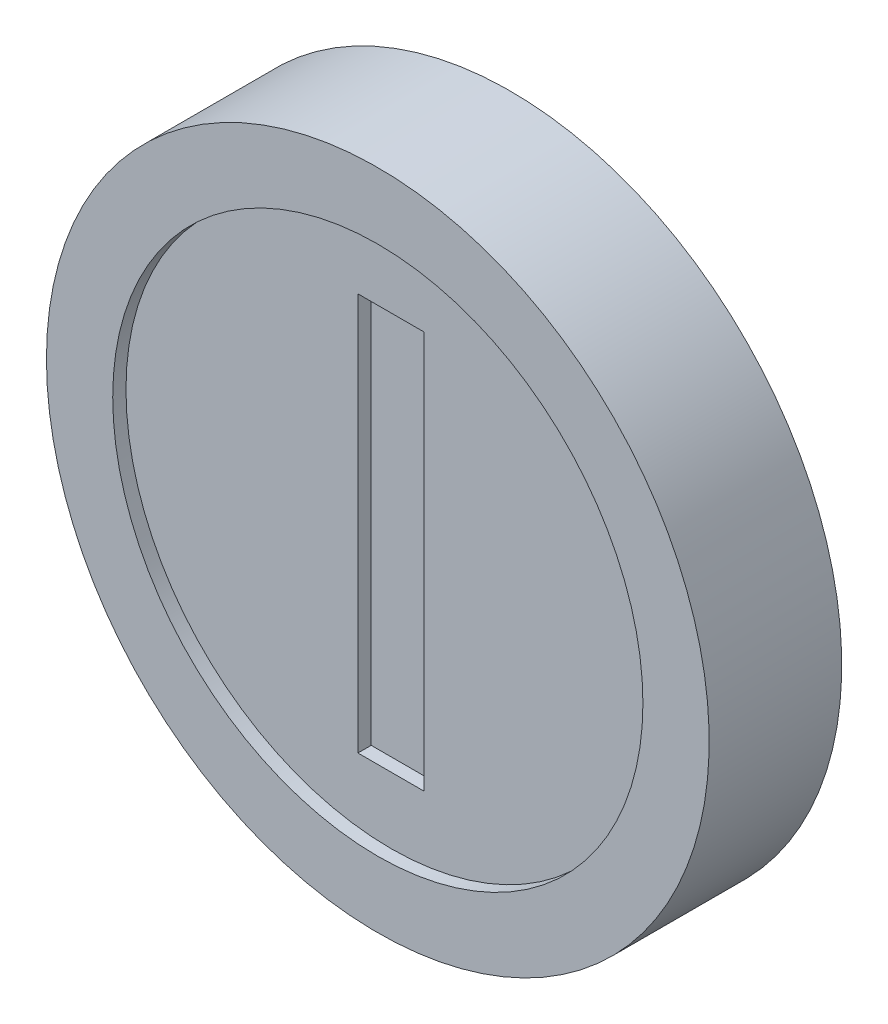
ISO-10303-21;
HEADER;
FILE_DESCRIPTION(('STEP AP214'),'2;1');
FILE_NAME('part.step','',(''),(''),'','','');
FILE_SCHEMA(('AUTOMOTIVE_DESIGN { 1 0 10303 214 1 1 1 1 }'));
ENDSEC;
DATA;
#1=APPLICATION_CONTEXT('core data for automotive mechanical design processes');
#2=APPLICATION_PROTOCOL_DEFINITION('international standard','automotive_design',2000,#1);
#3=PRODUCT_CONTEXT('',#1,'mechanical');
#4=PRODUCT('Part','Part','',(#3));
#5=PRODUCT_RELATED_PRODUCT_CATEGORY('part','',(#4));
#6=PRODUCT_DEFINITION_FORMATION('','',#4);
#7=PRODUCT_DEFINITION_CONTEXT('part definition',#1,'design');
#8=PRODUCT_DEFINITION('design','',#6,#7);
#9=PRODUCT_DEFINITION_SHAPE('','',#8);
#10=(LENGTH_UNIT() NAMED_UNIT(*) SI_UNIT(.MILLI.,.METRE.));
#11=(NAMED_UNIT(*) PLANE_ANGLE_UNIT() SI_UNIT($,.RADIAN.));
#12=(NAMED_UNIT(*) SI_UNIT($,.STERADIAN.) SOLID_ANGLE_UNIT());
#13=UNCERTAINTY_MEASURE_WITH_UNIT(LENGTH_MEASURE(1.E-05),#10,'distance_accuracy_value','');
#14=(GEOMETRIC_REPRESENTATION_CONTEXT(3) GLOBAL_UNCERTAINTY_ASSIGNED_CONTEXT((#13)) GLOBAL_UNIT_ASSIGNED_CONTEXT((#10,
#11,#12)) REPRESENTATION_CONTEXT('',''));
#15=CARTESIAN_POINT('',(0.,0.,0.));
#16=DIRECTION('',(0.,0.,1.));
#17=DIRECTION('',(1.,0.,0.));
#18=AXIS2_PLACEMENT_3D('',#15,#16,#17);
#19=CARTESIAN_POINT('',(0.,0.,-5.08));
#20=DIRECTION('',(0.,0.,1.));
#21=DIRECTION('',(1.,0.,0.));
#22=AXIS2_PLACEMENT_3D('',#19,#20,#21);
#23=PLANE('',#22);
#24=CARTESIAN_POINT('',(0.,0.,-5.08));
#25=DIRECTION('',(0.,0.,-1.));
#26=DIRECTION('',(-1.,0.,0.));
#27=AXIS2_PLACEMENT_3D('',#24,#25,#26);
#28=CIRCLE('',#27,25.4);
#29=CARTESIAN_POINT('',(-25.4,0.,-5.08));
#30=VERTEX_POINT('',#29);
#31=EDGE_CURVE('E175',#30,#30,#28,.T.);
#32=ORIENTED_EDGE('',*,*,#31,.T.);
#33=EDGE_LOOP('',(#32));
#34=FACE_BOUND('',#33,.T.);
#35=DIRECTION('',(0.,1.,0.));
#36=VECTOR('',#35,1.);
#37=CARTESIAN_POINT('',(3.175,-19.05,-5.08));
#38=LINE('',#37,#36);
#39=CARTESIAN_POINT('',(3.175,-19.05,-5.08));
#40=VERTEX_POINT('',#39);
#41=CARTESIAN_POINT('',(3.175,19.05,-5.08));
#42=VERTEX_POINT('',#41);
#43=EDGE_CURVE('E62',#40,#42,#38,.T.);
#44=ORIENTED_EDGE('',*,*,#43,.T.);
#45=DIRECTION('',(-1.,0.,0.));
#46=VECTOR('',#45,1.);
#47=CARTESIAN_POINT('',(-3.175,19.05,-5.08));
#48=LINE('',#47,#46);
#49=CARTESIAN_POINT('',(-3.175,19.05,-5.08));
#50=VERTEX_POINT('',#49);
#51=EDGE_CURVE('E132',#42,#50,#48,.T.);
#52=ORIENTED_EDGE('',*,*,#51,.T.);
#53=DIRECTION('',(0.,-1.,0.));
#54=VECTOR('',#53,1.);
#55=CARTESIAN_POINT('',(-3.175,-19.05,-5.08));
#56=LINE('',#55,#54);
#57=CARTESIAN_POINT('',(-3.175,-19.05,-5.08));
#58=VERTEX_POINT('',#57);
#59=EDGE_CURVE('E135',#50,#58,#56,.T.);
#60=ORIENTED_EDGE('',*,*,#59,.T.);
#61=DIRECTION('',(1.,0.,0.));
#62=VECTOR('',#61,1.);
#63=CARTESIAN_POINT('',(-3.175,-19.05,-5.08));
#64=LINE('',#63,#62);
#65=EDGE_CURVE('E141',#58,#40,#64,.T.);
#66=ORIENTED_EDGE('',*,*,#65,.T.);
#67=EDGE_LOOP('',(#44,#52,#60,#66));
#68=FACE_BOUND('',#67,.T.);
#69=ADVANCED_FACE('F47',(#34,#68),#23,.F.);
#70=CARTESIAN_POINT('',(0.,0.,5.08));
#71=DIRECTION('',(0.,0.,1.));
#72=DIRECTION('',(1.,0.,0.));
#73=AXIS2_PLACEMENT_3D('',#70,#71,#72);
#74=PLANE('',#73);
#75=DIRECTION('',(0.,1.,0.));
#76=VECTOR('',#75,1.);
#77=CARTESIAN_POINT('',(3.175,-19.05,5.08));
#78=LINE('',#77,#76);
#79=CARTESIAN_POINT('',(3.175,-19.05,5.08));
#80=VERTEX_POINT('',#79);
#81=CARTESIAN_POINT('',(3.175,19.05,5.08));
#82=VERTEX_POINT('',#81);
#83=EDGE_CURVE('E70',#80,#82,#78,.T.);
#84=ORIENTED_EDGE('',*,*,#83,.F.);
#85=DIRECTION('',(1.,0.,0.));
#86=VECTOR('',#85,1.);
#87=CARTESIAN_POINT('',(-3.175,-19.05,5.08));
#88=LINE('',#87,#86);
#89=CARTESIAN_POINT('',(-3.175,-19.05,5.08));
#90=VERTEX_POINT('',#89);
#91=EDGE_CURVE('E154',#90,#80,#88,.T.);
#92=ORIENTED_EDGE('',*,*,#91,.F.);
#93=DIRECTION('',(0.,-1.,0.));
#94=VECTOR('',#93,1.);
#95=CARTESIAN_POINT('',(-3.175,-19.05,5.08));
#96=LINE('',#95,#94);
#97=CARTESIAN_POINT('',(-3.175,19.05,5.08));
#98=VERTEX_POINT('',#97);
#99=EDGE_CURVE('E168',#98,#90,#96,.T.);
#100=ORIENTED_EDGE('',*,*,#99,.F.);
#101=DIRECTION('',(-1.,0.,0.));
#102=VECTOR('',#101,1.);
#103=CARTESIAN_POINT('',(-3.175,19.05,5.08));
#104=LINE('',#103,#102);
#105=EDGE_CURVE('E165',#82,#98,#104,.T.);
#106=ORIENTED_EDGE('',*,*,#105,.F.);
#107=EDGE_LOOP('',(#84,#92,#100,#106));
#108=FACE_BOUND('',#107,.T.);
#109=CARTESIAN_POINT('',(0.,0.,5.08));
#110=DIRECTION('',(0.,0.,-1.));
#111=DIRECTION('',(-1.,0.,0.));
#112=AXIS2_PLACEMENT_3D('',#109,#110,#111);
#113=CIRCLE('',#112,25.4);
#114=CARTESIAN_POINT('',(-25.4,0.,5.08));
#115=VERTEX_POINT('',#114);
#116=EDGE_CURVE('E11',#115,#115,#113,.T.);
#117=ORIENTED_EDGE('',*,*,#116,.F.);
#118=EDGE_LOOP('',(#117));
#119=FACE_BOUND('',#118,.T.);
#120=ADVANCED_FACE('F49',(#108,#119),#74,.T.);
#121=CARTESIAN_POINT('',(0.,0.,-88.99));
#122=DIRECTION('',(0.,0.,-1.));
#123=DIRECTION('',(-1.,0.,0.));
#124=AXIS2_PLACEMENT_3D('',#121,#122,#123);
#125=CYLINDRICAL_SURFACE('',#124,25.4);
#126=ORIENTED_EDGE('',*,*,#116,.T.);
#127=EDGE_LOOP('',(#126));
#128=FACE_BOUND('',#127,.T.);
#129=CARTESIAN_POINT('',(0.,0.,6.34999999999998));
#130=DIRECTION('',(0.,0.,-1.));
#131=DIRECTION('',(-1.,0.,0.));
#132=AXIS2_PLACEMENT_3D('',#129,#130,#131);
#133=CIRCLE('',#132,25.4);
#134=CARTESIAN_POINT('',(-25.4,0.,6.34999999999998));
#135=VERTEX_POINT('',#134);
#136=EDGE_CURVE('E55',#135,#135,#133,.T.);
#137=ORIENTED_EDGE('',*,*,#136,.F.);
#138=EDGE_LOOP('',(#137));
#139=FACE_BOUND('',#138,.T.);
#140=ADVANCED_FACE('F197',(#128,#139),#125,.F.);
#141=CARTESIAN_POINT('',(0.,0.,6.34999999999998));
#142=DIRECTION('',(0.,0.,1.));
#143=DIRECTION('',(1.,0.,0.));
#144=AXIS2_PLACEMENT_3D('',#141,#142,#143);
#145=PLANE('',#144);
#146=ORIENTED_EDGE('',*,*,#136,.T.);
#147=EDGE_LOOP('',(#146));
#148=FACE_BOUND('',#147,.T.);
#149=CARTESIAN_POINT('',(0.,0.,6.34999999999998));
#150=DIRECTION('',(0.,0.,-1.));
#151=DIRECTION('',(-1.,0.,0.));
#152=AXIS2_PLACEMENT_3D('',#149,#150,#151);
#153=CIRCLE('',#152,31.75);
#154=CARTESIAN_POINT('',(-31.75,0.,6.34999999999998));
#155=VERTEX_POINT('',#154);
#156=EDGE_CURVE('E189',#155,#155,#153,.T.);
#157=ORIENTED_EDGE('',*,*,#156,.F.);
#158=EDGE_LOOP('',(#157));
#159=FACE_BOUND('',#158,.T.);
#160=ADVANCED_FACE('F194',(#148,#159),#145,.T.);
#161=CARTESIAN_POINT('',(0.,0.,-88.99));
#162=DIRECTION('',(0.,0.,-1.));
#163=DIRECTION('',(-1.,0.,0.));
#164=AXIS2_PLACEMENT_3D('',#161,#162,#163);
#165=CYLINDRICAL_SURFACE('',#164,31.75);
#166=CARTESIAN_POINT('',(0.,0.,-6.35000000000002));
#167=DIRECTION('',(0.,0.,-1.));
#168=DIRECTION('',(-1.,0.,0.));
#169=AXIS2_PLACEMENT_3D('',#166,#167,#168);
#170=CIRCLE('',#169,31.75);
#171=CARTESIAN_POINT('',(-31.75,0.,-6.35000000000002));
#172=VERTEX_POINT('',#171);
#173=EDGE_CURVE('E186',#172,#172,#170,.T.);
#174=ORIENTED_EDGE('',*,*,#173,.F.);
#175=EDGE_LOOP('',(#174));
#176=FACE_BOUND('',#175,.T.);
#177=ORIENTED_EDGE('',*,*,#156,.T.);
#178=EDGE_LOOP('',(#177));
#179=FACE_BOUND('',#178,.T.);
#180=ADVANCED_FACE('F205',(#176,#179),#165,.T.);
#181=CARTESIAN_POINT('',(0.,0.,-6.35000000000002));
#182=DIRECTION('',(0.,0.,1.));
#183=DIRECTION('',(1.,0.,0.));
#184=AXIS2_PLACEMENT_3D('',#181,#182,#183);
#185=PLANE('',#184);
#186=CARTESIAN_POINT('',(0.,0.,-6.35000000000002));
#187=DIRECTION('',(0.,0.,-1.));
#188=DIRECTION('',(-1.,0.,0.));
#189=AXIS2_PLACEMENT_3D('',#186,#187,#188);
#190=CIRCLE('',#189,25.4);
#191=CARTESIAN_POINT('',(-25.4,0.,-6.35000000000002));
#192=VERTEX_POINT('',#191);
#193=EDGE_CURVE('E183',#192,#192,#190,.T.);
#194=ORIENTED_EDGE('',*,*,#193,.F.);
#195=EDGE_LOOP('',(#194));
#196=FACE_BOUND('',#195,.T.);
#197=ORIENTED_EDGE('',*,*,#173,.T.);
#198=EDGE_LOOP('',(#197));
#199=FACE_BOUND('',#198,.T.);
#200=ADVANCED_FACE('F212',(#196,#199),#185,.F.);
#201=ORIENTED_EDGE('',*,*,#193,.T.);
#202=EDGE_LOOP('',(#201));
#203=FACE_BOUND('',#202,.T.);
#204=ORIENTED_EDGE('',*,*,#31,.F.);
#205=EDGE_LOOP('',(#204));
#206=FACE_BOUND('',#205,.T.);
#207=ADVANCED_FACE('F201',(#203,#206),#125,.F.);
#208=CARTESIAN_POINT('',(3.175,-19.05,3.81));
#209=DIRECTION('',(1.,0.,0.));
#210=DIRECTION('',(0.,0.,-1.));
#211=AXIS2_PLACEMENT_3D('',#208,#209,#210);
#212=PLANE('',#211);
#213=ORIENTED_EDGE('',*,*,#83,.T.);
#214=DIRECTION('',(0.,0.,1.));
#215=VECTOR('',#214,1.);
#216=CARTESIAN_POINT('',(3.175,19.05,3.81));
#217=LINE('',#216,#215);
#218=CARTESIAN_POINT('',(3.175,19.05,3.81));
#219=VERTEX_POINT('',#218);
#220=EDGE_CURVE('E163',#219,#82,#217,.T.);
#221=ORIENTED_EDGE('',*,*,#220,.F.);
#222=DIRECTION('',(0.,1.,0.));
#223=VECTOR('',#222,1.);
#224=CARTESIAN_POINT('',(3.175,-19.05,3.81));
#225=LINE('',#224,#223);
#226=CARTESIAN_POINT('',(3.175,-19.05,3.81));
#227=VERTEX_POINT('',#226);
#228=EDGE_CURVE('E150',#227,#219,#225,.T.);
#229=ORIENTED_EDGE('',*,*,#228,.F.);
#230=DIRECTION('',(0.,0.,1.));
#231=VECTOR('',#230,1.);
#232=CARTESIAN_POINT('',(3.175,-19.05,3.81));
#233=LINE('',#232,#231);
#234=EDGE_CURVE('E173',#227,#80,#233,.T.);
#235=ORIENTED_EDGE('',*,*,#234,.T.);
#236=EDGE_LOOP('',(#213,#221,#229,#235));
#237=FACE_BOUND('',#236,.T.);
#238=ADVANCED_FACE('F211',(#237),#212,.F.);
#239=CARTESIAN_POINT('',(-3.175,-19.05,3.81));
#240=DIRECTION('',(0.,-1.,0.));
#241=DIRECTION('',(0.,0.,-1.));
#242=AXIS2_PLACEMENT_3D('',#239,#240,#241);
#243=PLANE('',#242);
#244=ORIENTED_EDGE('',*,*,#91,.T.);
#245=ORIENTED_EDGE('',*,*,#234,.F.);
#246=DIRECTION('',(1.,0.,0.));
#247=VECTOR('',#246,1.);
#248=CARTESIAN_POINT('',(-3.175,-19.05,3.81));
#249=LINE('',#248,#247);
#250=CARTESIAN_POINT('',(-3.175,-19.05,3.81));
#251=VERTEX_POINT('',#250);
#252=EDGE_CURVE('E160',#251,#227,#249,.T.);
#253=ORIENTED_EDGE('',*,*,#252,.F.);
#254=DIRECTION('',(0.,0.,1.));
#255=VECTOR('',#254,1.);
#256=CARTESIAN_POINT('',(-3.175,-19.05,3.81));
#257=LINE('',#256,#255);
#258=EDGE_CURVE('E176',#251,#90,#257,.T.);
#259=ORIENTED_EDGE('',*,*,#258,.T.);
#260=EDGE_LOOP('',(#244,#245,#253,#259));
#261=FACE_BOUND('',#260,.T.);
#262=ADVANCED_FACE('F224',(#261),#243,.F.);
#263=CARTESIAN_POINT('',(-3.175,-19.05,3.81));
#264=DIRECTION('',(-1.,0.,0.));
#265=DIRECTION('',(0.,0.,1.));
#266=AXIS2_PLACEMENT_3D('',#263,#264,#265);
#267=PLANE('',#266);
#268=ORIENTED_EDGE('',*,*,#99,.T.);
#269=ORIENTED_EDGE('',*,*,#258,.F.);
#270=DIRECTION('',(0.,-1.,0.));
#271=VECTOR('',#270,1.);
#272=CARTESIAN_POINT('',(-3.175,-19.05,3.81));
#273=LINE('',#272,#271);
#274=CARTESIAN_POINT('',(-3.175,19.05,3.81));
#275=VERTEX_POINT('',#274);
#276=EDGE_CURVE('E157',#275,#251,#273,.T.);
#277=ORIENTED_EDGE('',*,*,#276,.F.);
#278=DIRECTION('',(0.,0.,1.));
#279=VECTOR('',#278,1.);
#280=CARTESIAN_POINT('',(-3.175,19.05,3.81));
#281=LINE('',#280,#279);
#282=EDGE_CURVE('E178',#275,#98,#281,.T.);
#283=ORIENTED_EDGE('',*,*,#282,.T.);
#284=EDGE_LOOP('',(#268,#269,#277,#283));
#285=FACE_BOUND('',#284,.T.);
#286=ADVANCED_FACE('F229',(#285),#267,.F.);
#287=CARTESIAN_POINT('',(-3.175,19.05,3.81));
#288=DIRECTION('',(0.,1.,0.));
#289=DIRECTION('',(0.,0.,1.));
#290=AXIS2_PLACEMENT_3D('',#287,#288,#289);
#291=PLANE('',#290);
#292=ORIENTED_EDGE('',*,*,#105,.T.);
#293=ORIENTED_EDGE('',*,*,#282,.F.);
#294=DIRECTION('',(-1.,0.,0.));
#295=VECTOR('',#294,1.);
#296=CARTESIAN_POINT('',(-3.175,19.05,3.81));
#297=LINE('',#296,#295);
#298=EDGE_CURVE('E153',#219,#275,#297,.T.);
#299=ORIENTED_EDGE('',*,*,#298,.F.);
#300=ORIENTED_EDGE('',*,*,#220,.T.);
#301=EDGE_LOOP('',(#292,#293,#299,#300));
#302=FACE_BOUND('',#301,.T.);
#303=ADVANCED_FACE('F225',(#302),#291,.F.);
#304=CARTESIAN_POINT('',(0.,0.,3.81));
#305=DIRECTION('',(0.,0.,-1.));
#306=DIRECTION('',(-1.,0.,0.));
#307=AXIS2_PLACEMENT_3D('',#304,#305,#306);
#308=PLANE('',#307);
#309=ORIENTED_EDGE('',*,*,#228,.T.);
#310=ORIENTED_EDGE('',*,*,#298,.T.);
#311=ORIENTED_EDGE('',*,*,#276,.T.);
#312=ORIENTED_EDGE('',*,*,#252,.T.);
#313=EDGE_LOOP('',(#309,#310,#311,#312));
#314=FACE_BOUND('',#313,.T.);
#315=ADVANCED_FACE('F228',(#314),#308,.F.);
#316=CARTESIAN_POINT('',(3.175,-19.05,-3.81));
#317=DIRECTION('',(-1.,0.,0.));
#318=DIRECTION('',(0.,0.,1.));
#319=AXIS2_PLACEMENT_3D('',#316,#317,#318);
#320=PLANE('',#319);
#321=ORIENTED_EDGE('',*,*,#43,.F.);
#322=DIRECTION('',(0.,0.,-1.));
#323=VECTOR('',#322,1.);
#324=CARTESIAN_POINT('',(3.175,-19.05,-3.81));
#325=LINE('',#324,#323);
#326=CARTESIAN_POINT('',(3.175,-19.05,-3.81));
#327=VERTEX_POINT('',#326);
#328=EDGE_CURVE('E117',#327,#40,#325,.T.);
#329=ORIENTED_EDGE('',*,*,#328,.F.);
#330=DIRECTION('',(0.,1.,0.));
#331=VECTOR('',#330,1.);
#332=CARTESIAN_POINT('',(3.175,-19.05,-3.81));
#333=LINE('',#332,#331);
#334=CARTESIAN_POINT('',(3.175,19.05,-3.81));
#335=VERTEX_POINT('',#334);
#336=EDGE_CURVE('E124',#327,#335,#333,.T.);
#337=ORIENTED_EDGE('',*,*,#336,.T.);
#338=DIRECTION('',(0.,0.,-1.));
#339=VECTOR('',#338,1.);
#340=CARTESIAN_POINT('',(3.175,19.05,-3.81));
#341=LINE('',#340,#339);
#342=EDGE_CURVE('E145',#335,#42,#341,.T.);
#343=ORIENTED_EDGE('',*,*,#342,.T.);
#344=EDGE_LOOP('',(#321,#329,#337,#343));
#345=FACE_BOUND('',#344,.T.);
#346=ADVANCED_FACE('F127',(#345),#320,.T.);
#347=CARTESIAN_POINT('',(-3.175,19.05,-3.81));
#348=DIRECTION('',(0.,-1.,0.));
#349=DIRECTION('',(0.,0.,-1.));
#350=AXIS2_PLACEMENT_3D('',#347,#348,#349);
#351=PLANE('',#350);
#352=ORIENTED_EDGE('',*,*,#51,.F.);
#353=ORIENTED_EDGE('',*,*,#342,.F.);
#354=DIRECTION('',(-1.,0.,0.));
#355=VECTOR('',#354,1.);
#356=CARTESIAN_POINT('',(-3.175,19.05,-3.81));
#357=LINE('',#356,#355);
#358=CARTESIAN_POINT('',(-3.175,19.05,-3.81));
#359=VERTEX_POINT('',#358);
#360=EDGE_CURVE('E129',#335,#359,#357,.T.);
#361=ORIENTED_EDGE('',*,*,#360,.T.);
#362=DIRECTION('',(0.,0.,-1.));
#363=VECTOR('',#362,1.);
#364=CARTESIAN_POINT('',(-3.175,19.05,-3.81));
#365=LINE('',#364,#363);
#366=EDGE_CURVE('E147',#359,#50,#365,.T.);
#367=ORIENTED_EDGE('',*,*,#366,.T.);
#368=EDGE_LOOP('',(#352,#353,#361,#367));
#369=FACE_BOUND('',#368,.T.);
#370=ADVANCED_FACE('F240',(#369),#351,.T.);
#371=CARTESIAN_POINT('',(-3.175,-19.05,-3.81));
#372=DIRECTION('',(1.,0.,0.));
#373=DIRECTION('',(0.,0.,-1.));
#374=AXIS2_PLACEMENT_3D('',#371,#372,#373);
#375=PLANE('',#374);
#376=ORIENTED_EDGE('',*,*,#59,.F.);
#377=ORIENTED_EDGE('',*,*,#366,.F.);
#378=DIRECTION('',(0.,-1.,0.));
#379=VECTOR('',#378,1.);
#380=CARTESIAN_POINT('',(-3.175,-19.05,-3.81));
#381=LINE('',#380,#379);
#382=CARTESIAN_POINT('',(-3.175,-19.05,-3.81));
#383=VERTEX_POINT('',#382);
#384=EDGE_CURVE('E123',#359,#383,#381,.T.);
#385=ORIENTED_EDGE('',*,*,#384,.T.);
#386=DIRECTION('',(0.,0.,-1.));
#387=VECTOR('',#386,1.);
#388=CARTESIAN_POINT('',(-3.175,-19.05,-3.81));
#389=LINE('',#388,#387);
#390=EDGE_CURVE('E119',#383,#58,#389,.T.);
#391=ORIENTED_EDGE('',*,*,#390,.T.);
#392=EDGE_LOOP('',(#376,#377,#385,#391));
#393=FACE_BOUND('',#392,.T.);
#394=ADVANCED_FACE('F243',(#393),#375,.T.);
#395=CARTESIAN_POINT('',(-3.175,-19.05,-3.81));
#396=DIRECTION('',(0.,1.,0.));
#397=DIRECTION('',(0.,0.,1.));
#398=AXIS2_PLACEMENT_3D('',#395,#396,#397);
#399=PLANE('',#398);
#400=ORIENTED_EDGE('',*,*,#65,.F.);
#401=ORIENTED_EDGE('',*,*,#390,.F.);
#402=DIRECTION('',(1.,0.,0.));
#403=VECTOR('',#402,1.);
#404=CARTESIAN_POINT('',(-3.175,-19.05,-3.81));
#405=LINE('',#404,#403);
#406=EDGE_CURVE('E114',#383,#327,#405,.T.);
#407=ORIENTED_EDGE('',*,*,#406,.T.);
#408=ORIENTED_EDGE('',*,*,#328,.T.);
#409=EDGE_LOOP('',(#400,#401,#407,#408));
#410=FACE_BOUND('',#409,.T.);
#411=ADVANCED_FACE('F116',(#410),#399,.T.);
#412=CARTESIAN_POINT('',(0.,0.,-3.81));
#413=DIRECTION('',(0.,0.,1.));
#414=DIRECTION('',(-1.,0.,0.));
#415=AXIS2_PLACEMENT_3D('',#412,#413,#414);
#416=PLANE('',#415);
#417=ORIENTED_EDGE('',*,*,#336,.F.);
#418=ORIENTED_EDGE('',*,*,#406,.F.);
#419=ORIENTED_EDGE('',*,*,#384,.F.);
#420=ORIENTED_EDGE('',*,*,#360,.F.);
#421=EDGE_LOOP('',(#417,#418,#419,#420));
#422=FACE_BOUND('',#421,.T.);
#423=ADVANCED_FACE('F131',(#422),#416,.F.);
#424=CLOSED_SHELL('',(#69,#120,#140,#160,#180,#200,#207,#238,#262,#286,#303,#315,#346,#370,#394,
#411,#423));
#425=MANIFOLD_SOLID_BREP('B2',#424);
#426=ADVANCED_BREP_SHAPE_REPRESENTATION('',(#18,#425),#14);
#427=SHAPE_DEFINITION_REPRESENTATION(#9,#426);
ENDSEC;
END-ISO-10303-21;
